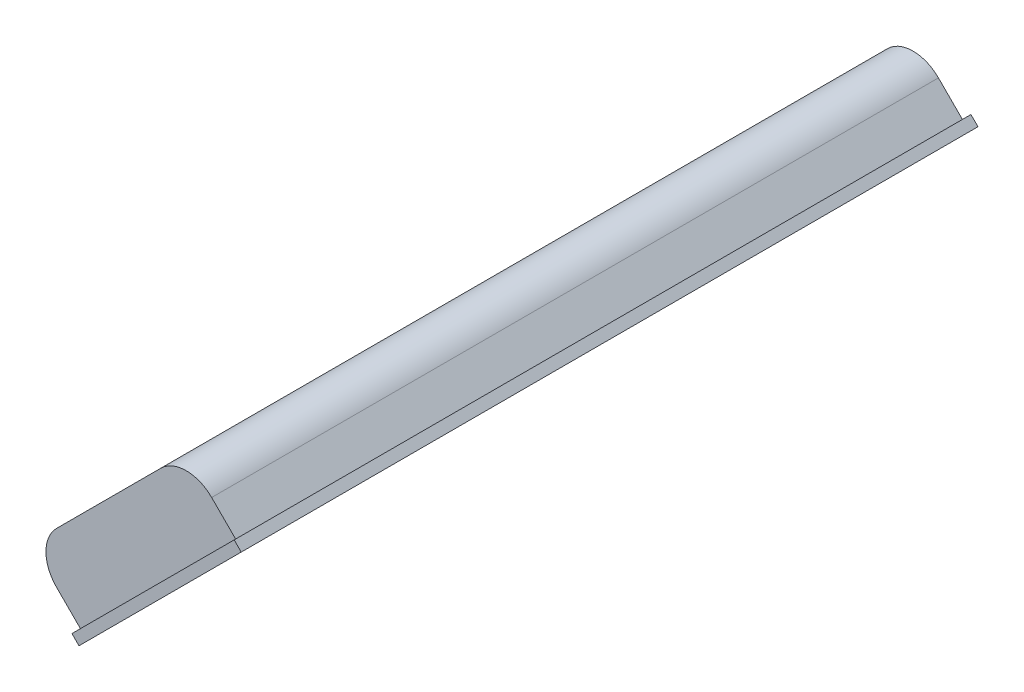
ISO-10303-21;
HEADER;
FILE_DESCRIPTION(('STEP AP214'),'2;1');
FILE_NAME('part.step','',(''),(''),'','','');
FILE_SCHEMA(('AUTOMOTIVE_DESIGN { 1 0 10303 214 1 1 1 1 }'));
ENDSEC;
DATA;
#1=APPLICATION_CONTEXT('core data for automotive mechanical design processes');
#2=APPLICATION_PROTOCOL_DEFINITION('international standard','automotive_design',2000,#1);
#3=PRODUCT_CONTEXT('',#1,'mechanical');
#4=PRODUCT('Part','Part','',(#3));
#5=PRODUCT_RELATED_PRODUCT_CATEGORY('part','',(#4));
#6=PRODUCT_DEFINITION_FORMATION('','',#4);
#7=PRODUCT_DEFINITION_CONTEXT('part definition',#1,'design');
#8=PRODUCT_DEFINITION('design','',#6,#7);
#9=PRODUCT_DEFINITION_SHAPE('','',#8);
#10=(LENGTH_UNIT() NAMED_UNIT(*) SI_UNIT(.MILLI.,.METRE.));
#11=(NAMED_UNIT(*) PLANE_ANGLE_UNIT() SI_UNIT($,.RADIAN.));
#12=(NAMED_UNIT(*) SI_UNIT($,.STERADIAN.) SOLID_ANGLE_UNIT());
#13=UNCERTAINTY_MEASURE_WITH_UNIT(LENGTH_MEASURE(1.E-05),#10,'distance_accuracy_value','');
#14=(GEOMETRIC_REPRESENTATION_CONTEXT(3) GLOBAL_UNCERTAINTY_ASSIGNED_CONTEXT((#13)) GLOBAL_UNIT_ASSIGNED_CONTEXT((#10,
#11,#12)) REPRESENTATION_CONTEXT('',''));
#15=CARTESIAN_POINT('',(0.,0.,0.));
#16=DIRECTION('',(0.,0.,1.));
#17=DIRECTION('',(1.,0.,0.));
#18=AXIS2_PLACEMENT_3D('',#15,#16,#17);
#19=CARTESIAN_POINT('',(-212.37952172938,305.717616846004,40.1));
#20=DIRECTION('',(-0.707106781186548,-0.707106781186547,0.));
#21=DIRECTION('',(0.707106781186547,-0.707106781186548,0.));
#22=AXIS2_PLACEMENT_3D('',#19,#20,#21);
#23=PLANE('',#22);
#24=DIRECTION('',(0.,0.,1.));
#25=VECTOR('',#24,1.);
#26=CARTESIAN_POINT('',(-197.954543393174,291.292638509798,40.1));
#27=LINE('',#26,#25);
#28=CARTESIAN_POINT('',(-197.954543393174,291.292638509798,-397.));
#29=VERTEX_POINT('',#28);
#30=CARTESIAN_POINT('',(-197.954543393174,291.292638509798,40.1));
#31=VERTEX_POINT('',#30);
#32=EDGE_CURVE('E151',#29,#31,#27,.T.);
#33=ORIENTED_EDGE('',*,*,#32,.F.);
#34=DIRECTION('',(-0.707106781186547,0.707106781186548,0.));
#35=VECTOR('',#34,1.);
#36=CARTESIAN_POINT('',(-212.37952172938,305.717616846004,-397.));
#37=LINE('',#36,#35);
#38=CARTESIAN_POINT('',(-212.37952172938,305.717616846004,-397.));
#39=VERTEX_POINT('',#38);
#40=EDGE_CURVE('E163',#29,#39,#37,.T.);
#41=ORIENTED_EDGE('',*,*,#40,.T.);
#42=DIRECTION('',(0.,0.,-1.));
#43=VECTOR('',#42,1.);
#44=CARTESIAN_POINT('',(-212.37952172938,305.717616846004,40.1));
#45=LINE('',#44,#43);
#46=CARTESIAN_POINT('',(-212.37952172938,305.717616846004,40.1));
#47=VERTEX_POINT('',#46);
#48=EDGE_CURVE('E48',#47,#39,#45,.T.);
#49=ORIENTED_EDGE('',*,*,#48,.F.);
#50=DIRECTION('',(-0.707106781186547,0.707106781186548,0.));
#51=VECTOR('',#50,1.);
#52=CARTESIAN_POINT('',(-212.37952172938,305.717616846004,40.1));
#53=LINE('',#52,#51);
#54=EDGE_CURVE('E93',#31,#47,#53,.T.);
#55=ORIENTED_EDGE('',*,*,#54,.F.);
#56=EDGE_LOOP('',(#33,#41,#49,#55));
#57=FACE_BOUND('',#56,.T.);
#58=ADVANCED_FACE('F41',(#57),#23,.F.);
#59=CARTESIAN_POINT('',(-287.049997822679,193.711902706055,40.1));
#60=DIRECTION('',(0.707106781186547,0.707106781186548,0.));
#61=DIRECTION('',(-0.707106781186548,0.707106781186547,0.));
#62=AXIS2_PLACEMENT_3D('',#59,#60,#61);
#63=PLANE('',#62);
#64=DIRECTION('',(0.,0.,-1.));
#65=VECTOR('',#64,1.);
#66=CARTESIAN_POINT('',(-291.292638509798,197.954543393174,40.1));
#67=LINE('',#66,#65);
#68=CARTESIAN_POINT('',(-291.292638509798,197.954543393174,40.1));
#69=VERTEX_POINT('',#68);
#70=CARTESIAN_POINT('',(-291.292638509798,197.954543393174,-397.));
#71=VERTEX_POINT('',#70);
#72=EDGE_CURVE('E54',#69,#71,#67,.T.);
#73=ORIENTED_EDGE('',*,*,#72,.F.);
#74=DIRECTION('',(0.707106781186548,-0.707106781186547,0.));
#75=VECTOR('',#74,1.);
#76=CARTESIAN_POINT('',(-287.049997822679,193.711902706055,40.1));
#77=LINE('',#76,#75);
#78=CARTESIAN_POINT('',(-305.717616846004,212.37952172938,40.1));
#79=VERTEX_POINT('',#78);
#80=EDGE_CURVE('E169',#79,#69,#77,.T.);
#81=ORIENTED_EDGE('',*,*,#80,.F.);
#82=DIRECTION('',(0.,0.,-1.));
#83=VECTOR('',#82,1.);
#84=CARTESIAN_POINT('',(-305.717616846004,212.37952172938,40.1));
#85=LINE('',#84,#83);
#86=CARTESIAN_POINT('',(-305.717616846004,212.37952172938,-397.));
#87=VERTEX_POINT('',#86);
#88=EDGE_CURVE('E171',#79,#87,#85,.T.);
#89=ORIENTED_EDGE('',*,*,#88,.T.);
#90=DIRECTION('',(0.707106781186548,-0.707106781186547,0.));
#91=VECTOR('',#90,1.);
#92=CARTESIAN_POINT('',(-287.049997822679,193.711902706055,-397.));
#93=LINE('',#92,#91);
#94=EDGE_CURVE('E165',#87,#71,#93,.T.);
#95=ORIENTED_EDGE('',*,*,#94,.T.);
#96=EDGE_LOOP('',(#73,#81,#89,#95));
#97=FACE_BOUND('',#96,.T.);
#98=ADVANCED_FACE('F204',(#97),#63,.F.);
#99=CARTESIAN_POINT('',(-290.444110372374,227.653028203009,40.1));
#100=DIRECTION('',(0.,0.,-1.));
#101=DIRECTION('',(-1.,0.,0.));
#102=AXIS2_PLACEMENT_3D('',#99,#100,#101);
#103=PLANE('',#102);
#104=DIRECTION('',(-0.707106781186548,-0.707106781186548,0.));
#105=VECTOR('',#104,1.);
#106=CARTESIAN_POINT('',(-276.019132036169,213.228049866803,40.1));
#107=LINE('',#106,#105);
#108=EDGE_CURVE('E157',#31,#69,#107,.T.);
#109=ORIENTED_EDGE('',*,*,#108,.F.);
#110=ORIENTED_EDGE('',*,*,#54,.T.);
#111=CARTESIAN_POINT('',(-227.653028203009,290.444110372374,40.1));
#112=DIRECTION('',(0.,0.,1.));
#113=DIRECTION('',(-1.,0.,0.));
#114=AXIS2_PLACEMENT_3D('',#111,#112,#113);
#115=CIRCLE('',#114,21.6);
#116=CARTESIAN_POINT('',(-242.926534676638,305.717616846004,40.1));
#117=VERTEX_POINT('',#116);
#118=EDGE_CURVE('E161',#47,#117,#115,.T.);
#119=ORIENTED_EDGE('',*,*,#118,.T.);
#120=DIRECTION('',(-0.707106781186548,-0.707106781186548,0.));
#121=VECTOR('',#120,1.);
#122=CARTESIAN_POINT('',(-305.717616846004,242.926534676638,40.1));
#123=LINE('',#122,#121);
#124=CARTESIAN_POINT('',(-305.717616846004,242.926534676638,40.1));
#125=VERTEX_POINT('',#124);
#126=EDGE_CURVE('E168',#117,#125,#123,.T.);
#127=ORIENTED_EDGE('',*,*,#126,.T.);
#128=CARTESIAN_POINT('',(-290.444110372374,227.653028203009,40.1));
#129=DIRECTION('',(0.,0.,1.));
#130=DIRECTION('',(-1.,0.,0.));
#131=AXIS2_PLACEMENT_3D('',#128,#129,#130);
#132=CIRCLE('',#131,21.6);
#133=EDGE_CURVE('E65',#125,#79,#132,.T.);
#134=ORIENTED_EDGE('',*,*,#133,.T.);
#135=ORIENTED_EDGE('',*,*,#80,.T.);
#136=EDGE_LOOP('',(#109,#110,#119,#127,#134,#135));
#137=FACE_BOUND('',#136,.T.);
#138=ADVANCED_FACE('F207',(#137),#103,.F.);
#139=CARTESIAN_POINT('',(-290.444110372374,227.653028203009,-397.));
#140=DIRECTION('',(0.,0.,-1.));
#141=DIRECTION('',(-1.,0.,0.));
#142=AXIS2_PLACEMENT_3D('',#139,#140,#141);
#143=PLANE('',#142);
#144=ORIENTED_EDGE('',*,*,#40,.F.);
#145=DIRECTION('',(-0.707106781186548,-0.707106781186548,0.));
#146=VECTOR('',#145,1.);
#147=CARTESIAN_POINT('',(-276.019132036169,213.228049866803,-397.));
#148=LINE('',#147,#146);
#149=EDGE_CURVE('E11',#29,#71,#148,.T.);
#150=ORIENTED_EDGE('',*,*,#149,.T.);
#151=ORIENTED_EDGE('',*,*,#94,.F.);
#152=CARTESIAN_POINT('',(-290.444110372374,227.653028203009,-397.));
#153=DIRECTION('',(0.,0.,1.));
#154=DIRECTION('',(-1.,0.,0.));
#155=AXIS2_PLACEMENT_3D('',#152,#153,#154);
#156=CIRCLE('',#155,21.6);
#157=CARTESIAN_POINT('',(-305.717616846004,242.926534676638,-397.));
#158=VERTEX_POINT('',#157);
#159=EDGE_CURVE('E83',#158,#87,#156,.T.);
#160=ORIENTED_EDGE('',*,*,#159,.F.);
#161=DIRECTION('',(-0.707106781186548,-0.707106781186548,0.));
#162=VECTOR('',#161,1.);
#163=CARTESIAN_POINT('',(-305.717616846004,242.926534676638,-397.));
#164=LINE('',#163,#162);
#165=CARTESIAN_POINT('',(-242.926534676638,305.717616846004,-397.));
#166=VERTEX_POINT('',#165);
#167=EDGE_CURVE('E174',#166,#158,#164,.T.);
#168=ORIENTED_EDGE('',*,*,#167,.F.);
#169=CARTESIAN_POINT('',(-227.653028203009,290.444110372374,-397.));
#170=DIRECTION('',(0.,0.,1.));
#171=DIRECTION('',(-1.,0.,0.));
#172=AXIS2_PLACEMENT_3D('',#169,#170,#171);
#173=CIRCLE('',#172,21.6);
#174=EDGE_CURVE('E173',#39,#166,#173,.T.);
#175=ORIENTED_EDGE('',*,*,#174,.F.);
#176=EDGE_LOOP('',(#144,#150,#151,#160,#168,#175));
#177=FACE_BOUND('',#176,.T.);
#178=ADVANCED_FACE('F199',(#177),#143,.T.);
#179=CARTESIAN_POINT('',(-227.653028203009,290.444110372374,40.1));
#180=DIRECTION('',(0.,0.,-1.));
#181=DIRECTION('',(-1.,0.,0.));
#182=AXIS2_PLACEMENT_3D('',#179,#180,#181);
#183=CYLINDRICAL_SURFACE('',#182,21.6);
#184=ORIENTED_EDGE('',*,*,#174,.T.);
#185=DIRECTION('',(0.,0.,-1.));
#186=VECTOR('',#185,1.);
#187=CARTESIAN_POINT('',(-242.926534676638,305.717616846004,40.1));
#188=LINE('',#187,#186);
#189=EDGE_CURVE('E182',#117,#166,#188,.T.);
#190=ORIENTED_EDGE('',*,*,#189,.F.);
#191=ORIENTED_EDGE('',*,*,#118,.F.);
#192=ORIENTED_EDGE('',*,*,#48,.T.);
#193=EDGE_LOOP('',(#184,#190,#191,#192));
#194=FACE_BOUND('',#193,.T.);
#195=ADVANCED_FACE('F189',(#194),#183,.T.);
#196=CARTESIAN_POINT('',(-305.717616846004,242.926534676638,40.1));
#197=DIRECTION('',(0.707106781186548,-0.707106781186548,0.));
#198=DIRECTION('',(0.707106781186548,0.707106781186548,0.));
#199=AXIS2_PLACEMENT_3D('',#196,#197,#198);
#200=PLANE('',#199);
#201=ORIENTED_EDGE('',*,*,#167,.T.);
#202=DIRECTION('',(0.,0.,-1.));
#203=VECTOR('',#202,1.);
#204=CARTESIAN_POINT('',(-305.717616846004,242.926534676638,40.1));
#205=LINE('',#204,#203);
#206=EDGE_CURVE('E181',#125,#158,#205,.T.);
#207=ORIENTED_EDGE('',*,*,#206,.F.);
#208=ORIENTED_EDGE('',*,*,#126,.F.);
#209=ORIENTED_EDGE('',*,*,#189,.T.);
#210=EDGE_LOOP('',(#201,#207,#208,#209));
#211=FACE_BOUND('',#210,.T.);
#212=ADVANCED_FACE('F197',(#211),#200,.F.);
#213=CARTESIAN_POINT('',(-290.444110372374,227.653028203009,40.1));
#214=DIRECTION('',(0.,0.,-1.));
#215=DIRECTION('',(-1.,0.,0.));
#216=AXIS2_PLACEMENT_3D('',#213,#214,#215);
#217=CYLINDRICAL_SURFACE('',#216,21.6);
#218=ORIENTED_EDGE('',*,*,#159,.T.);
#219=ORIENTED_EDGE('',*,*,#88,.F.);
#220=ORIENTED_EDGE('',*,*,#133,.F.);
#221=ORIENTED_EDGE('',*,*,#206,.T.);
#222=EDGE_LOOP('',(#218,#219,#220,#221));
#223=FACE_BOUND('',#222,.T.);
#224=ADVANCED_FACE('F205',(#223),#217,.T.);
#225=CARTESIAN_POINT('',(-293.413958853358,195.833223049614,43.1));
#226=DIRECTION('',(0.707106781186547,-0.707106781186547,0.));
#227=DIRECTION('',(0.707106781186548,0.707106781186548,0.));
#228=AXIS2_PLACEMENT_3D('',#225,#226,#227);
#229=PLANE('',#228);
#230=DIRECTION('',(-0.707106781186547,-0.707106781186547,0.));
#231=VECTOR('',#230,1.);
#232=CARTESIAN_POINT('',(-293.413958853358,195.833223049614,-400.));
#233=LINE('',#232,#231);
#234=CARTESIAN_POINT('',(-195.833223049614,293.413958853358,-400.));
#235=VERTEX_POINT('',#234);
#236=CARTESIAN_POINT('',(-293.413958853358,195.833223049614,-400.));
#237=VERTEX_POINT('',#236);
#238=EDGE_CURVE('E325',#235,#237,#233,.T.);
#239=ORIENTED_EDGE('',*,*,#238,.T.);
#240=DIRECTION('',(0.,0.,-1.));
#241=VECTOR('',#240,1.);
#242=CARTESIAN_POINT('',(-293.413958853358,195.833223049614,43.1));
#243=LINE('',#242,#241);
#244=CARTESIAN_POINT('',(-293.413958853358,195.833223049614,43.1));
#245=VERTEX_POINT('',#244);
#246=EDGE_CURVE('E135',#245,#237,#243,.T.);
#247=ORIENTED_EDGE('',*,*,#246,.F.);
#248=DIRECTION('',(-0.707106781186547,-0.707106781186547,0.));
#249=VECTOR('',#248,1.);
#250=CARTESIAN_POINT('',(-293.413958853358,195.833223049614,43.1));
#251=LINE('',#250,#249);
#252=CARTESIAN_POINT('',(-195.833223049614,293.413958853358,43.1));
#253=VERTEX_POINT('',#252);
#254=EDGE_CURVE('E129',#253,#245,#251,.T.);
#255=ORIENTED_EDGE('',*,*,#254,.F.);
#256=DIRECTION('',(0.,0.,-1.));
#257=VECTOR('',#256,1.);
#258=CARTESIAN_POINT('',(-195.833223049614,293.413958853358,43.1));
#259=LINE('',#258,#257);
#260=EDGE_CURVE('E127',#253,#235,#259,.T.);
#261=ORIENTED_EDGE('',*,*,#260,.T.);
#262=EDGE_LOOP('',(#239,#247,#255,#261));
#263=FACE_BOUND('',#262,.T.);
#264=ORIENTED_EDGE('',*,*,#32,.T.);
#265=ORIENTED_EDGE('',*,*,#108,.T.);
#266=ORIENTED_EDGE('',*,*,#72,.T.);
#267=ORIENTED_EDGE('',*,*,#149,.F.);
#268=EDGE_LOOP('',(#264,#265,#266,#267));
#269=FACE_BOUND('',#268,.T.);
#270=ADVANCED_FACE('F130',(#263,#269),#229,.F.);
#271=CARTESIAN_POINT('',(-195.833223049614,293.413958853358,43.1));
#272=DIRECTION('',(-0.70710678118655,-0.707106781186545,0.));
#273=DIRECTION('',(0.707106781186545,-0.70710678118655,0.));
#274=AXIS2_PLACEMENT_3D('',#271,#272,#273);
#275=PLANE('',#274);
#276=DIRECTION('',(-0.707106781186545,0.70710678118655,0.));
#277=VECTOR('',#276,1.);
#278=CARTESIAN_POINT('',(-195.833223049614,293.413958853358,-400.));
#279=LINE('',#278,#277);
#280=CARTESIAN_POINT('',(-191.590582362495,289.171318166239,-400.));
#281=VERTEX_POINT('',#280);
#282=EDGE_CURVE('E147',#281,#235,#279,.T.);
#283=ORIENTED_EDGE('',*,*,#282,.T.);
#284=ORIENTED_EDGE('',*,*,#260,.F.);
#285=DIRECTION('',(-0.707106781186545,0.70710678118655,0.));
#286=VECTOR('',#285,1.);
#287=CARTESIAN_POINT('',(-195.833223049614,293.413958853358,43.1));
#288=LINE('',#287,#286);
#289=CARTESIAN_POINT('',(-191.590582362495,289.171318166239,43.1));
#290=VERTEX_POINT('',#289);
#291=EDGE_CURVE('E140',#290,#253,#288,.T.);
#292=ORIENTED_EDGE('',*,*,#291,.F.);
#293=DIRECTION('',(0.,0.,-1.));
#294=VECTOR('',#293,1.);
#295=CARTESIAN_POINT('',(-191.590582362495,289.171318166239,43.1));
#296=LINE('',#295,#294);
#297=EDGE_CURVE('E320',#290,#281,#296,.T.);
#298=ORIENTED_EDGE('',*,*,#297,.T.);
#299=EDGE_LOOP('',(#283,#284,#292,#298));
#300=FACE_BOUND('',#299,.T.);
#301=ADVANCED_FACE('F150',(#300),#275,.F.);
#302=CARTESIAN_POINT('',(-289.171318166239,191.590582362495,43.1));
#303=DIRECTION('',(0.707106781186545,0.70710678118655,0.));
#304=DIRECTION('',(-0.70710678118655,0.707106781186545,0.));
#305=AXIS2_PLACEMENT_3D('',#302,#303,#304);
#306=PLANE('',#305);
#307=DIRECTION('',(0.70710678118655,-0.707106781186545,0.));
#308=VECTOR('',#307,1.);
#309=CARTESIAN_POINT('',(-289.171318166239,191.590582362495,-400.));
#310=LINE('',#309,#308);
#311=CARTESIAN_POINT('',(-289.171318166239,191.590582362495,-400.));
#312=VERTEX_POINT('',#311);
#313=EDGE_CURVE('E318',#237,#312,#310,.T.);
#314=ORIENTED_EDGE('',*,*,#313,.T.);
#315=DIRECTION('',(0.,0.,-1.));
#316=VECTOR('',#315,1.);
#317=CARTESIAN_POINT('',(-289.171318166239,191.590582362495,43.1));
#318=LINE('',#317,#316);
#319=CARTESIAN_POINT('',(-289.171318166239,191.590582362495,43.1));
#320=VERTEX_POINT('',#319);
#321=EDGE_CURVE('E153',#320,#312,#318,.T.);
#322=ORIENTED_EDGE('',*,*,#321,.F.);
#323=DIRECTION('',(0.70710678118655,-0.707106781186545,0.));
#324=VECTOR('',#323,1.);
#325=CARTESIAN_POINT('',(-289.171318166239,191.590582362495,43.1));
#326=LINE('',#325,#324);
#327=EDGE_CURVE('E138',#245,#320,#326,.T.);
#328=ORIENTED_EDGE('',*,*,#327,.F.);
#329=ORIENTED_EDGE('',*,*,#246,.T.);
#330=EDGE_LOOP('',(#314,#322,#328,#329));
#331=FACE_BOUND('',#330,.T.);
#332=ADVANCED_FACE('F215',(#331),#306,.F.);
#333=CARTESIAN_POINT('',(0.,0.,43.1));
#334=DIRECTION('',(0.,0.,-1.));
#335=DIRECTION('',(-1.,0.,0.));
#336=AXIS2_PLACEMENT_3D('',#333,#334,#335);
#337=PLANE('',#336);
#338=ORIENTED_EDGE('',*,*,#291,.T.);
#339=ORIENTED_EDGE('',*,*,#254,.T.);
#340=ORIENTED_EDGE('',*,*,#327,.T.);
#341=DIRECTION('',(0.707106781186548,0.707106781186548,0.));
#342=VECTOR('',#341,1.);
#343=CARTESIAN_POINT('',(-191.590582362495,289.171318166239,43.1));
#344=LINE('',#343,#342);
#345=EDGE_CURVE('E145',#320,#290,#344,.T.);
#346=ORIENTED_EDGE('',*,*,#345,.T.);
#347=EDGE_LOOP('',(#338,#339,#340,#346));
#348=FACE_BOUND('',#347,.T.);
#349=ADVANCED_FACE('F139',(#348),#337,.F.);
#350=CARTESIAN_POINT('',(0.,0.,-400.));
#351=DIRECTION('',(0.,0.,-1.));
#352=DIRECTION('',(-1.,0.,0.));
#353=AXIS2_PLACEMENT_3D('',#350,#351,#352);
#354=PLANE('',#353);
#355=ORIENTED_EDGE('',*,*,#282,.F.);
#356=DIRECTION('',(0.707106781186548,0.707106781186548,0.));
#357=VECTOR('',#356,1.);
#358=CARTESIAN_POINT('',(-191.590582362495,289.171318166239,-400.));
#359=LINE('',#358,#357);
#360=EDGE_CURVE('E149',#312,#281,#359,.T.);
#361=ORIENTED_EDGE('',*,*,#360,.F.);
#362=ORIENTED_EDGE('',*,*,#313,.F.);
#363=ORIENTED_EDGE('',*,*,#238,.F.);
#364=EDGE_LOOP('',(#355,#361,#362,#363));
#365=FACE_BOUND('',#364,.T.);
#366=ADVANCED_FACE('F273',(#365),#354,.T.);
#367=CARTESIAN_POINT('',(-193.711902706055,287.049997822679,40.1));
#368=DIRECTION('',(-0.707106781186548,0.707106781186548,0.));
#369=DIRECTION('',(-0.707106781186548,-0.707106781186548,0.));
#370=AXIS2_PLACEMENT_3D('',#367,#368,#369);
#371=PLANE('',#370);
#372=ORIENTED_EDGE('',*,*,#360,.T.);
#373=ORIENTED_EDGE('',*,*,#297,.F.);
#374=ORIENTED_EDGE('',*,*,#345,.F.);
#375=ORIENTED_EDGE('',*,*,#321,.T.);
#376=EDGE_LOOP('',(#372,#373,#374,#375));
#377=FACE_BOUND('',#376,.T.);
#378=ADVANCED_FACE('F226',(#377),#371,.F.);
#379=CLOSED_SHELL('',(#58,#98,#138,#178,#195,#212,#224,#270,#301,#332,#349,#366,#378));
#380=MANIFOLD_SOLID_BREP('B2',#379);
#381=ADVANCED_BREP_SHAPE_REPRESENTATION('',(#18,#380),#14);
#382=SHAPE_DEFINITION_REPRESENTATION(#9,#381);
ENDSEC;
END-ISO-10303-21;
